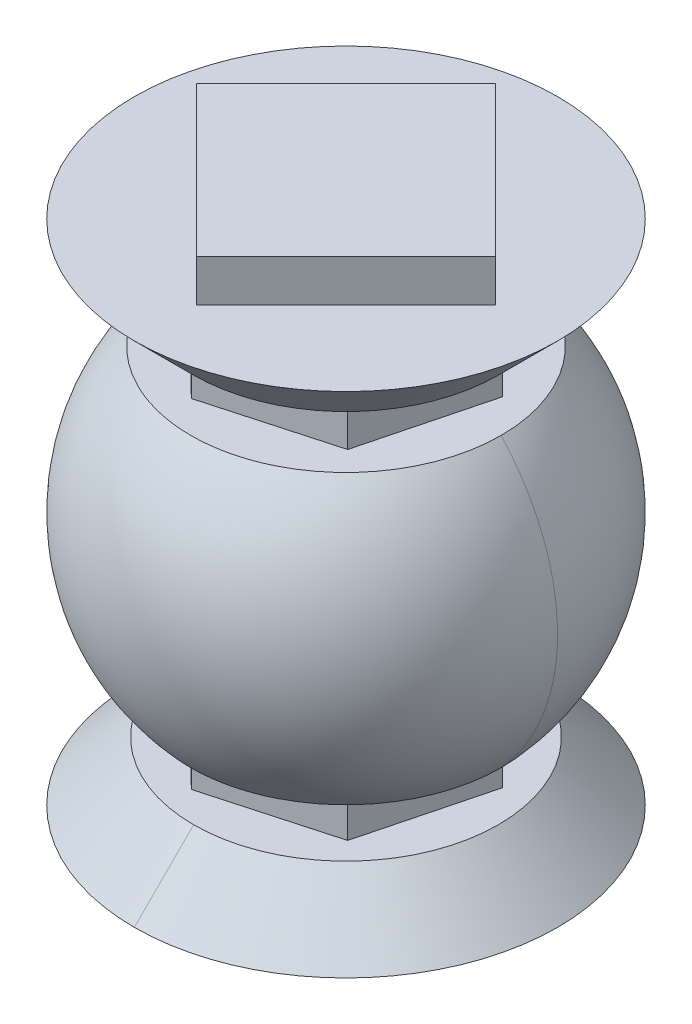
ISO-10303-21;
HEADER;
FILE_DESCRIPTION(('STEP AP214'),'2;1');
FILE_NAME('part.step','',(''),(''),'','','');
FILE_SCHEMA(('AUTOMOTIVE_DESIGN { 1 0 10303 214 1 1 1 1 }'));
ENDSEC;
DATA;
#1=APPLICATION_CONTEXT('core data for automotive mechanical design processes');
#2=APPLICATION_PROTOCOL_DEFINITION('international standard','automotive_design',2000,#1);
#3=PRODUCT_CONTEXT('',#1,'mechanical');
#4=PRODUCT('Part','Part','',(#3));
#5=PRODUCT_RELATED_PRODUCT_CATEGORY('part','',(#4));
#6=PRODUCT_DEFINITION_FORMATION('','',#4);
#7=PRODUCT_DEFINITION_CONTEXT('part definition',#1,'design');
#8=PRODUCT_DEFINITION('design','',#6,#7);
#9=PRODUCT_DEFINITION_SHAPE('','',#8);
#10=(LENGTH_UNIT() NAMED_UNIT(*) SI_UNIT(.MILLI.,.METRE.));
#11=(NAMED_UNIT(*) PLANE_ANGLE_UNIT() SI_UNIT($,.RADIAN.));
#12=(NAMED_UNIT(*) SI_UNIT($,.STERADIAN.) SOLID_ANGLE_UNIT());
#13=UNCERTAINTY_MEASURE_WITH_UNIT(LENGTH_MEASURE(1.E-05),#10,'distance_accuracy_value','');
#14=(GEOMETRIC_REPRESENTATION_CONTEXT(3) GLOBAL_UNCERTAINTY_ASSIGNED_CONTEXT((#13)) GLOBAL_UNIT_ASSIGNED_CONTEXT((#10,
#11,#12)) REPRESENTATION_CONTEXT('',''));
#15=CARTESIAN_POINT('',(0.,0.,0.));
#16=DIRECTION('',(0.,0.,1.));
#17=DIRECTION('',(1.,0.,0.));
#18=AXIS2_PLACEMENT_3D('',#15,#16,#17);
#19=CARTESIAN_POINT('',(0.,-35.,0.));
#20=DIRECTION('',(0.,-1.,0.));
#21=DIRECTION('',(0.,0.,-1.));
#22=AXIS2_PLACEMENT_3D('',#19,#20,#21);
#23=PLANE('',#22);
#24=CARTESIAN_POINT('',(0.,-35.,0.));
#25=DIRECTION('',(0.,1.,0.));
#26=DIRECTION('',(0.,0.,1.));
#27=AXIS2_PLACEMENT_3D('',#24,#25,#26);
#28=CIRCLE('',#27,0.00235012890702213);
#29=CARTESIAN_POINT('',(0.,-35.,0.00235012890702213));
#30=VERTEX_POINT('',#29);
#31=CARTESIAN_POINT('',(0.,-35.,-0.00235012890702213));
#32=VERTEX_POINT('',#31);
#33=EDGE_CURVE('E11',#30,#32,#28,.T.);
#34=ORIENTED_EDGE('',*,*,#33,.T.);
#35=CARTESIAN_POINT('',(0.,-35.,0.));
#36=DIRECTION('',(0.,1.,0.));
#37=DIRECTION('',(0.,0.,1.));
#38=AXIS2_PLACEMENT_3D('',#35,#36,#37);
#39=CIRCLE('',#38,0.00235012890702213);
#40=EDGE_CURVE('E591',#32,#30,#39,.T.);
#41=ORIENTED_EDGE('',*,*,#40,.T.);
#42=EDGE_LOOP('',(#34,#41));
#43=FACE_BOUND('',#42,.T.);
#44=DIRECTION('',(0.707106781186548,0.,-0.707106781186548));
#45=VECTOR('',#44,1.);
#46=CARTESIAN_POINT('',(17.6776695296637,-35.,0.));
#47=LINE('',#46,#45);
#48=CARTESIAN_POINT('',(0.,-35.,17.6776695296637));
#49=VERTEX_POINT('',#48);
#50=CARTESIAN_POINT('',(17.6776695296637,-35.,0.));
#51=VERTEX_POINT('',#50);
#52=EDGE_CURVE('E329',#49,#51,#47,.T.);
#53=ORIENTED_EDGE('',*,*,#52,.F.);
#54=DIRECTION('',(0.707106781186548,0.,0.707106781186548));
#55=VECTOR('',#54,1.);
#56=CARTESIAN_POINT('',(-17.6776695296637,-35.,0.));
#57=LINE('',#56,#55);
#58=CARTESIAN_POINT('',(-17.6776695296637,-35.,0.));
#59=VERTEX_POINT('',#58);
#60=EDGE_CURVE('E38',#59,#49,#57,.T.);
#61=ORIENTED_EDGE('',*,*,#60,.F.);
#62=DIRECTION('',(-0.707106781186548,0.,0.707106781186548));
#63=VECTOR('',#62,1.);
#64=CARTESIAN_POINT('',(0.,-35.,-17.6776695296637));
#65=LINE('',#64,#63);
#66=CARTESIAN_POINT('',(0.,-35.,-17.6776695296637));
#67=VERTEX_POINT('',#66);
#68=EDGE_CURVE('E46',#67,#59,#65,.T.);
#69=ORIENTED_EDGE('',*,*,#68,.F.);
#70=DIRECTION('',(-0.707106781186548,0.,-0.707106781186548));
#71=VECTOR('',#70,1.);
#72=CARTESIAN_POINT('',(0.,-35.,-17.6776695296637));
#73=LINE('',#72,#71);
#74=EDGE_CURVE('E349',#51,#67,#73,.T.);
#75=ORIENTED_EDGE('',*,*,#74,.F.);
#76=EDGE_LOOP('',(#53,#61,#69,#75));
#77=FACE_BOUND('',#76,.T.);
#78=ADVANCED_FACE('F16',(#43,#77),#23,.T.);
#79=CARTESIAN_POINT('',(0.,67.707423580786,0.));
#80=DIRECTION('',(0.,1.,0.));
#81=DIRECTION('',(0.,0.,1.));
#82=AXIS2_PLACEMENT_3D('',#79,#80,#81);
#83=CYLINDRICAL_SURFACE('',#82,0.00235012890702213);
#84=DIRECTION('',(0.,1.,0.));
#85=VECTOR('',#84,1.);
#86=CARTESIAN_POINT('',(0.,67.707423580786,-0.00235012890702213));
#87=LINE('',#86,#85);
#88=CARTESIAN_POINT('',(0.,-30.,-0.00235012890702213));
#89=VERTEX_POINT('',#88);
#90=EDGE_CURVE('E579',#32,#89,#87,.T.);
#91=ORIENTED_EDGE('',*,*,#90,.F.);
#92=ORIENTED_EDGE('',*,*,#33,.F.);
#93=DIRECTION('',(0.,1.,0.));
#94=VECTOR('',#93,1.);
#95=CARTESIAN_POINT('',(0.,67.707423580786,0.00235012890702213));
#96=LINE('',#95,#94);
#97=CARTESIAN_POINT('',(0.,-30.,0.00235012890702213));
#98=VERTEX_POINT('',#97);
#99=EDGE_CURVE('E582',#30,#98,#96,.T.);
#100=ORIENTED_EDGE('',*,*,#99,.T.);
#101=CARTESIAN_POINT('',(0.,-30.,0.));
#102=DIRECTION('',(0.,1.,0.));
#103=DIRECTION('',(0.,0.,1.));
#104=AXIS2_PLACEMENT_3D('',#101,#102,#103);
#105=CIRCLE('',#104,0.00235012890702213);
#106=EDGE_CURVE('E25',#98,#89,#105,.T.);
#107=ORIENTED_EDGE('',*,*,#106,.T.);
#108=EDGE_LOOP('',(#91,#92,#100,#107));
#109=FACE_BOUND('',#108,.T.);
#110=ADVANCED_FACE('F577',(#109),#83,.F.);
#111=CARTESIAN_POINT('',(0.,-30.,0.));
#112=DIRECTION('',(0.,1.,0.));
#113=DIRECTION('',(1.,0.,0.));
#114=AXIS2_PLACEMENT_3D('',#111,#112,#113);
#115=PLANE('',#114);
#116=ORIENTED_EDGE('',*,*,#106,.F.);
#117=CARTESIAN_POINT('',(0.,-30.,0.));
#118=DIRECTION('',(0.,1.,0.));
#119=DIRECTION('',(0.,0.,1.));
#120=AXIS2_PLACEMENT_3D('',#117,#118,#119);
#121=CIRCLE('',#120,0.00235012890702213);
#122=EDGE_CURVE('E585',#89,#98,#121,.T.);
#123=ORIENTED_EDGE('',*,*,#122,.F.);
#124=EDGE_LOOP('',(#116,#123));
#125=FACE_BOUND('',#124,.T.);
#126=ADVANCED_FACE('F18',(#125),#115,.F.);
#127=CARTESIAN_POINT('',(-17.6776695296637,-30.,0.));
#128=DIRECTION('',(0.707106781186548,0.,-0.707106781186548));
#129=DIRECTION('',(0.,-1.,0.));
#130=AXIS2_PLACEMENT_3D('',#127,#128,#129);
#131=PLANE('',#130);
#132=ORIENTED_EDGE('',*,*,#60,.T.);
#133=DIRECTION('',(0.,-1.,0.));
#134=VECTOR('',#133,1.);
#135=CARTESIAN_POINT('',(0.,-30.,17.6776695296637));
#136=LINE('',#135,#134);
#137=CARTESIAN_POINT('',(0.,-30.,17.6776695296637));
#138=VERTEX_POINT('',#137);
#139=EDGE_CURVE('E345',#138,#49,#136,.T.);
#140=ORIENTED_EDGE('',*,*,#139,.F.);
#141=DIRECTION('',(0.707106781186548,0.,0.707106781186548));
#142=VECTOR('',#141,1.);
#143=CARTESIAN_POINT('',(-17.6776695296637,-30.,0.));
#144=LINE('',#143,#142);
#145=CARTESIAN_POINT('',(-17.6776695296637,-30.,0.));
#146=VERTEX_POINT('',#145);
#147=EDGE_CURVE('E548',#146,#138,#144,.T.);
#148=ORIENTED_EDGE('',*,*,#147,.F.);
#149=DIRECTION('',(0.,-1.,0.));
#150=VECTOR('',#149,1.);
#151=CARTESIAN_POINT('',(-17.6776695296637,-30.,0.));
#152=LINE('',#151,#150);
#153=EDGE_CURVE('E566',#146,#59,#152,.T.);
#154=ORIENTED_EDGE('',*,*,#153,.T.);
#155=EDGE_LOOP('',(#132,#140,#148,#154));
#156=FACE_BOUND('',#155,.T.);
#157=ADVANCED_FACE('F1319',(#156),#131,.F.);
#158=CARTESIAN_POINT('',(0.,-30.,-17.6776695296637));
#159=DIRECTION('',(0.707106781186548,0.,0.707106781186548));
#160=DIRECTION('',(0.,-1.,0.));
#161=AXIS2_PLACEMENT_3D('',#158,#159,#160);
#162=PLANE('',#161);
#163=ORIENTED_EDGE('',*,*,#68,.T.);
#164=ORIENTED_EDGE('',*,*,#153,.F.);
#165=DIRECTION('',(-0.707106781186548,0.,0.707106781186548));
#166=VECTOR('',#165,1.);
#167=CARTESIAN_POINT('',(0.,-30.,-17.6776695296637));
#168=LINE('',#167,#166);
#169=CARTESIAN_POINT('',(0.,-30.,-17.6776695296637));
#170=VERTEX_POINT('',#169);
#171=EDGE_CURVE('E547',#170,#146,#168,.T.);
#172=ORIENTED_EDGE('',*,*,#171,.F.);
#173=DIRECTION('',(0.,-1.,0.));
#174=VECTOR('',#173,1.);
#175=CARTESIAN_POINT('',(0.,-30.,-17.6776695296637));
#176=LINE('',#175,#174);
#177=EDGE_CURVE('E561',#170,#67,#176,.T.);
#178=ORIENTED_EDGE('',*,*,#177,.T.);
#179=EDGE_LOOP('',(#163,#164,#172,#178));
#180=FACE_BOUND('',#179,.T.);
#181=ADVANCED_FACE('F1323',(#180),#162,.F.);
#182=CARTESIAN_POINT('',(0.,-30.,-17.6776695296637));
#183=DIRECTION('',(-0.707106781186548,0.,0.707106781186548));
#184=DIRECTION('',(0.,1.,0.));
#185=AXIS2_PLACEMENT_3D('',#182,#183,#184);
#186=PLANE('',#185);
#187=ORIENTED_EDGE('',*,*,#74,.T.);
#188=ORIENTED_EDGE('',*,*,#177,.F.);
#189=DIRECTION('',(-0.707106781186548,0.,-0.707106781186548));
#190=VECTOR('',#189,1.);
#191=CARTESIAN_POINT('',(0.,-30.,-17.6776695296637));
#192=LINE('',#191,#190);
#193=CARTESIAN_POINT('',(17.6776695296637,-30.,0.));
#194=VERTEX_POINT('',#193);
#195=EDGE_CURVE('E543',#194,#170,#192,.T.);
#196=ORIENTED_EDGE('',*,*,#195,.F.);
#197=DIRECTION('',(0.,-1.,0.));
#198=VECTOR('',#197,1.);
#199=CARTESIAN_POINT('',(17.6776695296637,-30.,0.));
#200=LINE('',#199,#198);
#201=EDGE_CURVE('E332',#194,#51,#200,.T.);
#202=ORIENTED_EDGE('',*,*,#201,.T.);
#203=EDGE_LOOP('',(#187,#188,#196,#202));
#204=FACE_BOUND('',#203,.T.);
#205=ADVANCED_FACE('F1407',(#204),#186,.F.);
#206=CARTESIAN_POINT('',(17.6776695296637,-30.,0.));
#207=DIRECTION('',(-0.707106781186548,0.,-0.707106781186548));
#208=DIRECTION('',(-0.707106781186548,0.,0.707106781186548));
#209=AXIS2_PLACEMENT_3D('',#206,#207,#208);
#210=PLANE('',#209);
#211=ORIENTED_EDGE('',*,*,#52,.T.);
#212=ORIENTED_EDGE('',*,*,#201,.F.);
#213=DIRECTION('',(0.707106781186548,0.,-0.707106781186548));
#214=VECTOR('',#213,1.);
#215=CARTESIAN_POINT('',(17.6776695296637,-30.,0.));
#216=LINE('',#215,#214);
#217=EDGE_CURVE('E333',#138,#194,#216,.T.);
#218=ORIENTED_EDGE('',*,*,#217,.F.);
#219=ORIENTED_EDGE('',*,*,#139,.T.);
#220=EDGE_LOOP('',(#211,#212,#218,#219));
#221=FACE_BOUND('',#220,.T.);
#222=ADVANCED_FACE('F1396',(#221),#210,.F.);
#223=CARTESIAN_POINT('',(0.,-30.,0.));
#224=DIRECTION('',(0.,1.,0.));
#225=DIRECTION('',(1.,0.,0.));
#226=AXIS2_PLACEMENT_3D('',#223,#224,#225);
#227=PLANE('',#226);
#228=ORIENTED_EDGE('',*,*,#195,.T.);
#229=ORIENTED_EDGE('',*,*,#171,.T.);
#230=ORIENTED_EDGE('',*,*,#147,.T.);
#231=ORIENTED_EDGE('',*,*,#217,.T.);
#232=EDGE_LOOP('',(#228,#229,#230,#231));
#233=FACE_BOUND('',#232,.T.);
#234=CARTESIAN_POINT('',(0.,-30.,0.));
#235=DIRECTION('',(0.,-1.,0.));
#236=DIRECTION('',(0.,0.,1.));
#237=AXIS2_PLACEMENT_3D('',#234,#235,#236);
#238=CIRCLE('',#237,25.002350128907);
#239=CARTESIAN_POINT('',(0.,-30.,-25.002350128907));
#240=VERTEX_POINT('',#239);
#241=CARTESIAN_POINT('',(0.,-30.,25.002350128907));
#242=VERTEX_POINT('',#241);
#243=EDGE_CURVE('E300',#240,#242,#238,.T.);
#244=ORIENTED_EDGE('',*,*,#243,.T.);
#245=CARTESIAN_POINT('',(0.,-30.,0.));
#246=DIRECTION('',(0.,-1.,0.));
#247=DIRECTION('',(0.,0.,1.));
#248=AXIS2_PLACEMENT_3D('',#245,#246,#247);
#249=CIRCLE('',#248,25.002350128907);
#250=EDGE_CURVE('E295',#242,#240,#249,.T.);
#251=ORIENTED_EDGE('',*,*,#250,.T.);
#252=EDGE_LOOP('',(#244,#251));
#253=FACE_BOUND('',#252,.T.);
#254=ADVANCED_FACE('F1385',(#233,#253),#227,.F.);
#255=CARTESIAN_POINT('',(0.,35.,0.));
#256=DIRECTION('',(0.,-1.,0.));
#257=DIRECTION('',(0.,0.,-1.));
#258=AXIS2_PLACEMENT_3D('',#255,#256,#257);
#259=PLANE('',#258);
#260=CARTESIAN_POINT('',(0.,35.,0.));
#261=DIRECTION('',(0.,1.,0.));
#262=DIRECTION('',(0.,0.,1.));
#263=AXIS2_PLACEMENT_3D('',#260,#261,#262);
#264=CIRCLE('',#263,0.00235012890702213);
#265=CARTESIAN_POINT('',(0.,35.,0.00235012890702213));
#266=VERTEX_POINT('',#265);
#267=CARTESIAN_POINT('',(0.,35.,-0.00235012890702213));
#268=VERTEX_POINT('',#267);
#269=EDGE_CURVE('E540',#266,#268,#264,.T.);
#270=ORIENTED_EDGE('',*,*,#269,.F.);
#271=CARTESIAN_POINT('',(0.,35.,0.));
#272=DIRECTION('',(0.,1.,0.));
#273=DIRECTION('',(0.,0.,1.));
#274=AXIS2_PLACEMENT_3D('',#271,#272,#273);
#275=CIRCLE('',#274,0.00235012890702213);
#276=EDGE_CURVE('E312',#268,#266,#275,.T.);
#277=ORIENTED_EDGE('',*,*,#276,.F.);
#278=EDGE_LOOP('',(#270,#277));
#279=FACE_BOUND('',#278,.T.);
#280=DIRECTION('',(0.707106781186548,0.,-0.707106781186548));
#281=VECTOR('',#280,1.);
#282=CARTESIAN_POINT('',(17.6776695296637,35.,0.));
#283=LINE('',#282,#281);
#284=CARTESIAN_POINT('',(0.,35.,17.6776695296637));
#285=VERTEX_POINT('',#284);
#286=CARTESIAN_POINT('',(17.6776695296637,35.,0.));
#287=VERTEX_POINT('',#286);
#288=EDGE_CURVE('E523',#285,#287,#283,.T.);
#289=ORIENTED_EDGE('',*,*,#288,.T.);
#290=DIRECTION('',(-0.707106781186548,0.,-0.707106781186548));
#291=VECTOR('',#290,1.);
#292=CARTESIAN_POINT('',(0.,35.,-17.6776695296637));
#293=LINE('',#292,#291);
#294=CARTESIAN_POINT('',(0.,35.,-17.6776695296637));
#295=VERTEX_POINT('',#294);
#296=EDGE_CURVE('E473',#287,#295,#293,.T.);
#297=ORIENTED_EDGE('',*,*,#296,.T.);
#298=DIRECTION('',(-0.707106781186548,0.,0.707106781186548));
#299=VECTOR('',#298,1.);
#300=CARTESIAN_POINT('',(0.,35.,-17.6776695296637));
#301=LINE('',#300,#299);
#302=CARTESIAN_POINT('',(-17.6776695296637,35.,0.));
#303=VERTEX_POINT('',#302);
#304=EDGE_CURVE('E474',#295,#303,#301,.T.);
#305=ORIENTED_EDGE('',*,*,#304,.T.);
#306=DIRECTION('',(0.707106781186548,0.,0.707106781186548));
#307=VECTOR('',#306,1.);
#308=CARTESIAN_POINT('',(-17.6776695296637,35.,0.));
#309=LINE('',#308,#307);
#310=EDGE_CURVE('E442',#303,#285,#309,.T.);
#311=ORIENTED_EDGE('',*,*,#310,.T.);
#312=EDGE_LOOP('',(#289,#297,#305,#311));
#313=FACE_BOUND('',#312,.T.);
#314=ADVANCED_FACE('F644',(#279,#313),#259,.F.);
#315=CARTESIAN_POINT('',(0.,67.707423580786,0.));
#316=DIRECTION('',(0.,1.,0.));
#317=DIRECTION('',(0.,0.,1.));
#318=AXIS2_PLACEMENT_3D('',#315,#316,#317);
#319=CYLINDRICAL_SURFACE('',#318,0.00235012890702213);
#320=DIRECTION('',(0.,1.,0.));
#321=VECTOR('',#320,1.);
#322=CARTESIAN_POINT('',(0.,67.707423580786,-0.00235012890702213));
#323=LINE('',#322,#321);
#324=CARTESIAN_POINT('',(0.,30.,-0.00235012890702213));
#325=VERTEX_POINT('',#324);
#326=EDGE_CURVE('E604',#325,#268,#323,.T.);
#327=ORIENTED_EDGE('',*,*,#326,.F.);
#328=CARTESIAN_POINT('',(0.,30.,0.));
#329=DIRECTION('',(0.,1.,0.));
#330=DIRECTION('',(0.,0.,1.));
#331=AXIS2_PLACEMENT_3D('',#328,#329,#330);
#332=CIRCLE('',#331,0.00235012890702213);
#333=CARTESIAN_POINT('',(0.,30.,0.00235012890702213));
#334=VERTEX_POINT('',#333);
#335=EDGE_CURVE('E537',#334,#325,#332,.T.);
#336=ORIENTED_EDGE('',*,*,#335,.F.);
#337=DIRECTION('',(0.,1.,0.));
#338=VECTOR('',#337,1.);
#339=CARTESIAN_POINT('',(0.,67.707423580786,0.00235012890702213));
#340=LINE('',#339,#338);
#341=EDGE_CURVE('E305',#334,#266,#340,.T.);
#342=ORIENTED_EDGE('',*,*,#341,.T.);
#343=ORIENTED_EDGE('',*,*,#269,.T.);
#344=EDGE_LOOP('',(#327,#336,#342,#343));
#345=FACE_BOUND('',#344,.T.);
#346=ADVANCED_FACE('F664',(#345),#319,.F.);
#347=CARTESIAN_POINT('',(0.,30.,0.));
#348=DIRECTION('',(0.,1.,0.));
#349=DIRECTION('',(1.,0.,0.));
#350=AXIS2_PLACEMENT_3D('',#347,#348,#349);
#351=PLANE('',#350);
#352=ORIENTED_EDGE('',*,*,#335,.T.);
#353=CARTESIAN_POINT('',(0.,30.,0.));
#354=DIRECTION('',(0.,1.,0.));
#355=DIRECTION('',(0.,0.,1.));
#356=AXIS2_PLACEMENT_3D('',#353,#354,#355);
#357=CIRCLE('',#356,0.00235012890702213);
#358=EDGE_CURVE('E610',#325,#334,#357,.T.);
#359=ORIENTED_EDGE('',*,*,#358,.T.);
#360=EDGE_LOOP('',(#352,#359));
#361=FACE_BOUND('',#360,.T.);
#362=ADVANCED_FACE('F656',(#361),#351,.T.);
#363=CARTESIAN_POINT('',(0.,30.,-17.6776695296637));
#364=DIRECTION('',(0.707106781186548,0.,-0.707106781186548));
#365=DIRECTION('',(0.,-1.,0.));
#366=AXIS2_PLACEMENT_3D('',#363,#364,#365);
#367=PLANE('',#366);
#368=ORIENTED_EDGE('',*,*,#296,.F.);
#369=DIRECTION('',(0.,1.,0.));
#370=VECTOR('',#369,1.);
#371=CARTESIAN_POINT('',(17.6776695296637,30.,0.));
#372=LINE('',#371,#370);
#373=CARTESIAN_POINT('',(17.6776695296637,30.,0.));
#374=VERTEX_POINT('',#373);
#375=EDGE_CURVE('E438',#374,#287,#372,.T.);
#376=ORIENTED_EDGE('',*,*,#375,.F.);
#377=DIRECTION('',(-0.707106781186548,0.,-0.707106781186548));
#378=VECTOR('',#377,1.);
#379=CARTESIAN_POINT('',(0.,30.,-17.6776695296637));
#380=LINE('',#379,#378);
#381=CARTESIAN_POINT('',(0.,30.,-17.6776695296637));
#382=VERTEX_POINT('',#381);
#383=EDGE_CURVE('E515',#374,#382,#380,.T.);
#384=ORIENTED_EDGE('',*,*,#383,.T.);
#385=DIRECTION('',(0.,1.,0.));
#386=VECTOR('',#385,1.);
#387=CARTESIAN_POINT('',(0.,30.,-17.6776695296637));
#388=LINE('',#387,#386);
#389=EDGE_CURVE('E469',#382,#295,#388,.T.);
#390=ORIENTED_EDGE('',*,*,#389,.T.);
#391=EDGE_LOOP('',(#368,#376,#384,#390));
#392=FACE_BOUND('',#391,.T.);
#393=ADVANCED_FACE('F654',(#392),#367,.T.);
#394=CARTESIAN_POINT('',(0.,30.,-17.6776695296637));
#395=DIRECTION('',(-0.707106781186548,0.,-0.707106781186548));
#396=DIRECTION('',(-0.707106781186548,0.,0.707106781186548));
#397=AXIS2_PLACEMENT_3D('',#394,#395,#396);
#398=PLANE('',#397);
#399=ORIENTED_EDGE('',*,*,#304,.F.);
#400=ORIENTED_EDGE('',*,*,#389,.F.);
#401=DIRECTION('',(-0.707106781186548,0.,0.707106781186548));
#402=VECTOR('',#401,1.);
#403=CARTESIAN_POINT('',(0.,30.,-17.6776695296637));
#404=LINE('',#403,#402);
#405=CARTESIAN_POINT('',(-17.6776695296637,30.,0.));
#406=VERTEX_POINT('',#405);
#407=EDGE_CURVE('E462',#382,#406,#404,.T.);
#408=ORIENTED_EDGE('',*,*,#407,.T.);
#409=DIRECTION('',(0.,1.,0.));
#410=VECTOR('',#409,1.);
#411=CARTESIAN_POINT('',(-17.6776695296637,30.,0.));
#412=LINE('',#411,#410);
#413=EDGE_CURVE('E529',#406,#303,#412,.T.);
#414=ORIENTED_EDGE('',*,*,#413,.T.);
#415=EDGE_LOOP('',(#399,#400,#408,#414));
#416=FACE_BOUND('',#415,.T.);
#417=ADVANCED_FACE('F647',(#416),#398,.T.);
#418=CARTESIAN_POINT('',(-17.6776695296637,30.,0.));
#419=DIRECTION('',(-0.707106781186548,0.,0.707106781186548));
#420=DIRECTION('',(0.,1.,0.));
#421=AXIS2_PLACEMENT_3D('',#418,#419,#420);
#422=PLANE('',#421);
#423=ORIENTED_EDGE('',*,*,#310,.F.);
#424=ORIENTED_EDGE('',*,*,#413,.F.);
#425=DIRECTION('',(0.707106781186548,0.,0.707106781186548));
#426=VECTOR('',#425,1.);
#427=CARTESIAN_POINT('',(-17.6776695296637,30.,0.));
#428=LINE('',#427,#426);
#429=CARTESIAN_POINT('',(0.,30.,17.6776695296637));
#430=VERTEX_POINT('',#429);
#431=EDGE_CURVE('E458',#406,#430,#428,.T.);
#432=ORIENTED_EDGE('',*,*,#431,.T.);
#433=DIRECTION('',(0.,1.,0.));
#434=VECTOR('',#433,1.);
#435=CARTESIAN_POINT('',(0.,30.,17.6776695296637));
#436=LINE('',#435,#434);
#437=EDGE_CURVE('E443',#430,#285,#436,.T.);
#438=ORIENTED_EDGE('',*,*,#437,.T.);
#439=EDGE_LOOP('',(#423,#424,#432,#438));
#440=FACE_BOUND('',#439,.T.);
#441=ADVANCED_FACE('F638',(#440),#422,.T.);
#442=CARTESIAN_POINT('',(17.6776695296637,30.,0.));
#443=DIRECTION('',(0.707106781186548,0.,0.707106781186548));
#444=DIRECTION('',(0.,-1.,0.));
#445=AXIS2_PLACEMENT_3D('',#442,#443,#444);
#446=PLANE('',#445);
#447=ORIENTED_EDGE('',*,*,#288,.F.);
#448=ORIENTED_EDGE('',*,*,#437,.F.);
#449=DIRECTION('',(0.707106781186548,0.,-0.707106781186548));
#450=VECTOR('',#449,1.);
#451=CARTESIAN_POINT('',(17.6776695296637,30.,0.));
#452=LINE('',#451,#450);
#453=EDGE_CURVE('E519',#430,#374,#452,.T.);
#454=ORIENTED_EDGE('',*,*,#453,.T.);
#455=ORIENTED_EDGE('',*,*,#375,.T.);
#456=EDGE_LOOP('',(#447,#448,#454,#455));
#457=FACE_BOUND('',#456,.T.);
#458=ADVANCED_FACE('F642',(#457),#446,.T.);
#459=CARTESIAN_POINT('',(0.,30.,0.));
#460=DIRECTION('',(0.,1.,0.));
#461=DIRECTION('',(1.,0.,0.));
#462=AXIS2_PLACEMENT_3D('',#459,#460,#461);
#463=PLANE('',#462);
#464=ORIENTED_EDGE('',*,*,#431,.F.);
#465=ORIENTED_EDGE('',*,*,#407,.F.);
#466=ORIENTED_EDGE('',*,*,#383,.F.);
#467=ORIENTED_EDGE('',*,*,#453,.F.);
#468=EDGE_LOOP('',(#464,#465,#466,#467));
#469=FACE_BOUND('',#468,.T.);
#470=CARTESIAN_POINT('',(0.,30.,0.));
#471=DIRECTION('',(0.,1.,0.));
#472=DIRECTION('',(0.,0.,1.));
#473=AXIS2_PLACEMENT_3D('',#470,#471,#472);
#474=CIRCLE('',#473,25.002350128907);
#475=CARTESIAN_POINT('',(0.,30.,25.002350128907));
#476=VERTEX_POINT('',#475);
#477=CARTESIAN_POINT('',(0.,30.,-25.002350128907));
#478=VERTEX_POINT('',#477);
#479=EDGE_CURVE('E320',#476,#478,#474,.T.);
#480=ORIENTED_EDGE('',*,*,#479,.T.);
#481=CARTESIAN_POINT('',(0.,30.,0.));
#482=DIRECTION('',(0.,1.,0.));
#483=DIRECTION('',(0.,0.,1.));
#484=AXIS2_PLACEMENT_3D('',#481,#482,#483);
#485=CIRCLE('',#484,25.002350128907);
#486=EDGE_CURVE('E290',#478,#476,#485,.T.);
#487=ORIENTED_EDGE('',*,*,#486,.T.);
#488=EDGE_LOOP('',(#480,#487));
#489=FACE_BOUND('',#488,.T.);
#490=ADVANCED_FACE('F651',(#469,#489),#463,.T.);
#491=CARTESIAN_POINT('',(0.,-20.,0.));
#492=DIRECTION('',(0.,-1.,0.));
#493=DIRECTION('',(0.,0.,-1.));
#494=AXIS2_PLACEMENT_3D('',#491,#492,#493);
#495=CONICAL_SURFACE('',#494,15.,0.785515656036115);
#496=DIRECTION('',(0.,-0.707023696464563,0.707189856147262));
#497=VECTOR('',#496,1.);
#498=CARTESIAN_POINT('',(0.,-20.,15.));
#499=LINE('',#498,#497);
#500=CARTESIAN_POINT('',(0.,-23.,18.0007050386721));
#501=VERTEX_POINT('',#500);
#502=EDGE_CURVE('E293',#501,#242,#499,.T.);
#503=ORIENTED_EDGE('',*,*,#502,.F.);
#504=CARTESIAN_POINT('',(0.,-23.,0.));
#505=DIRECTION('',(0.,-1.,0.));
#506=DIRECTION('',(0.,0.,1.));
#507=AXIS2_PLACEMENT_3D('',#504,#505,#506);
#508=CIRCLE('',#507,18.0007050386721);
#509=CARTESIAN_POINT('',(0.,-23.,-18.0007050386721));
#510=VERTEX_POINT('',#509);
#511=EDGE_CURVE('E280',#501,#510,#508,.T.);
#512=ORIENTED_EDGE('',*,*,#511,.T.);
#513=DIRECTION('',(0.,-0.707023696464563,-0.707189856147262));
#514=VECTOR('',#513,1.);
#515=CARTESIAN_POINT('',(0.,-20.,-15.));
#516=LINE('',#515,#514);
#517=EDGE_CURVE('E303',#510,#240,#516,.T.);
#518=ORIENTED_EDGE('',*,*,#517,.T.);
#519=ORIENTED_EDGE('',*,*,#250,.F.);
#520=EDGE_LOOP('',(#503,#512,#518,#519));
#521=FACE_BOUND('',#520,.T.);
#522=ADVANCED_FACE('F294',(#521),#495,.T.);
#523=CARTESIAN_POINT('',(10.7017224091414,-23.,10.5106202232637));
#524=DIRECTION('',(0.968218238813169,0.,0.250106861220409));
#525=DIRECTION('',(0.,-1.,0.));
#526=AXIS2_PLACEMENT_3D('',#523,#524,#525);
#527=PLANE('',#526);
#528=DIRECTION('',(0.250106861220409,0.,-0.968218238813169));
#529=VECTOR('',#528,1.);
#530=CARTESIAN_POINT('',(10.7017224091414,-17.,10.5106202232637));
#531=LINE('',#530,#529);
#532=CARTESIAN_POINT('',(10.7017224091414,-17.,10.5106202232637));
#533=VERTEX_POINT('',#532);
#534=CARTESIAN_POINT('',(14.4533253274476,-17.,-4.01265335893382));
#535=VERTEX_POINT('',#534);
#536=EDGE_CURVE('E418',#533,#535,#531,.T.);
#537=ORIENTED_EDGE('',*,*,#536,.F.);
#538=DIRECTION('',(0.,1.,0.));
#539=VECTOR('',#538,1.);
#540=CARTESIAN_POINT('',(10.7017224091414,-23.,10.5106202232637));
#541=LINE('',#540,#539);
#542=CARTESIAN_POINT('',(10.7017224091414,-23.,10.5106202232637));
#543=VERTEX_POINT('',#542);
#544=EDGE_CURVE('E500',#543,#533,#541,.T.);
#545=ORIENTED_EDGE('',*,*,#544,.F.);
#546=DIRECTION('',(0.250106861220409,0.,-0.968218238813169));
#547=VECTOR('',#546,1.);
#548=CARTESIAN_POINT('',(10.7017224091414,-23.,10.5106202232637));
#549=LINE('',#548,#547);
#550=CARTESIAN_POINT('',(14.4533253274476,-23.,-4.01265335893382));
#551=VERTEX_POINT('',#550);
#552=EDGE_CURVE('E325',#543,#551,#549,.T.);
#553=ORIENTED_EDGE('',*,*,#552,.T.);
#554=DIRECTION('',(0.,1.,0.));
#555=VECTOR('',#554,1.);
#556=CARTESIAN_POINT('',(14.4533253274476,-23.,-4.01265335893382));
#557=LINE('',#556,#555);
#558=EDGE_CURVE('E507',#551,#535,#557,.T.);
#559=ORIENTED_EDGE('',*,*,#558,.T.);
#560=EDGE_LOOP('',(#537,#545,#553,#559));
#561=FACE_BOUND('',#560,.T.);
#562=ADVANCED_FACE('F1292',(#561),#527,.T.);
#563=CARTESIAN_POINT('',(14.4533253274476,-23.,-4.01265335893382));
#564=DIRECTION('',(0.700708014884248,0.,-0.713448160609428));
#565=DIRECTION('',(0.,-1.,0.));
#566=AXIS2_PLACEMENT_3D('',#563,#564,#565);
#567=PLANE('',#566);
#568=DIRECTION('',(-0.713448160609428,0.,-0.700708014884248));
#569=VECTOR('',#568,1.);
#570=CARTESIAN_POINT('',(14.4533253274476,-17.,-4.01265335893382));
#571=LINE('',#570,#569);
#572=CARTESIAN_POINT('',(3.75160291830613,-17.,-14.5232735821975));
#573=VERTEX_POINT('',#572);
#574=EDGE_CURVE('E413',#535,#573,#571,.T.);
#575=ORIENTED_EDGE('',*,*,#574,.F.);
#576=ORIENTED_EDGE('',*,*,#558,.F.);
#577=DIRECTION('',(-0.713448160609428,0.,-0.700708014884248));
#578=VECTOR('',#577,1.);
#579=CARTESIAN_POINT('',(14.4533253274476,-23.,-4.01265335893382));
#580=LINE('',#579,#578);
#581=CARTESIAN_POINT('',(3.75160291830613,-23.,-14.5232735821975));
#582=VERTEX_POINT('',#581);
#583=EDGE_CURVE('E321',#551,#582,#580,.T.);
#584=ORIENTED_EDGE('',*,*,#583,.T.);
#585=DIRECTION('',(0.,1.,0.));
#586=VECTOR('',#585,1.);
#587=CARTESIAN_POINT('',(3.75160291830613,-23.,-14.5232735821975));
#588=LINE('',#587,#586);
#589=EDGE_CURVE('E491',#582,#573,#588,.T.);
#590=ORIENTED_EDGE('',*,*,#589,.T.);
#591=EDGE_LOOP('',(#575,#576,#584,#590));
#592=FACE_BOUND('',#591,.T.);
#593=ADVANCED_FACE('F697',(#592),#567,.T.);
#594=CARTESIAN_POINT('',(3.75160291830613,-23.,-14.5232735821975));
#595=DIRECTION('',(-0.267510223928921,0.,-0.963555021829837));
#596=DIRECTION('',(-0.963555021829837,0.,0.267510223928921));
#597=AXIS2_PLACEMENT_3D('',#594,#595,#596);
#598=PLANE('',#597);
#599=DIRECTION('',(-0.963555021829837,0.,0.267510223928921));
#600=VECTOR('',#599,1.);
#601=CARTESIAN_POINT('',(3.75160291830613,-17.,-14.5232735821975));
#602=LINE('',#601,#600);
#603=CARTESIAN_POINT('',(-10.7017224091414,-17.,-10.5106202232637));
#604=VERTEX_POINT('',#603);
#605=EDGE_CURVE('E417',#573,#604,#602,.T.);
#606=ORIENTED_EDGE('',*,*,#605,.F.);
#607=ORIENTED_EDGE('',*,*,#589,.F.);
#608=DIRECTION('',(-0.963555021829837,0.,0.267510223928921));
#609=VECTOR('',#608,1.);
#610=CARTESIAN_POINT('',(3.75160291830613,-23.,-14.5232735821975));
#611=LINE('',#610,#609);
#612=CARTESIAN_POINT('',(-10.7017224091414,-23.,-10.5106202232637));
#613=VERTEX_POINT('',#612);
#614=EDGE_CURVE('E326',#582,#613,#611,.T.);
#615=ORIENTED_EDGE('',*,*,#614,.T.);
#616=DIRECTION('',(0.,1.,0.));
#617=VECTOR('',#616,1.);
#618=CARTESIAN_POINT('',(-10.7017224091414,-23.,-10.5106202232637));
#619=LINE('',#618,#617);
#620=EDGE_CURVE('E488',#613,#604,#619,.T.);
#621=ORIENTED_EDGE('',*,*,#620,.T.);
#622=EDGE_LOOP('',(#606,#607,#615,#621));
#623=FACE_BOUND('',#622,.T.);
#624=ADVANCED_FACE('F692',(#623),#598,.T.);
#625=CARTESIAN_POINT('',(-10.7017224091414,-23.,-10.5106202232637));
#626=DIRECTION('',(-0.968218238813169,0.,-0.250106861220409));
#627=DIRECTION('',(-0.250106861220409,0.,0.968218238813169));
#628=AXIS2_PLACEMENT_3D('',#625,#626,#627);
#629=PLANE('',#628);
#630=DIRECTION('',(-0.250106861220409,0.,0.968218238813169));
#631=VECTOR('',#630,1.);
#632=CARTESIAN_POINT('',(-10.7017224091414,-17.,-10.5106202232637));
#633=LINE('',#632,#631);
#634=CARTESIAN_POINT('',(-14.4533253274476,-17.,4.01265335893382));
#635=VERTEX_POINT('',#634);
#636=EDGE_CURVE('E487',#604,#635,#633,.T.);
#637=ORIENTED_EDGE('',*,*,#636,.F.);
#638=ORIENTED_EDGE('',*,*,#620,.F.);
#639=DIRECTION('',(-0.250106861220409,0.,0.968218238813169));
#640=VECTOR('',#639,1.);
#641=CARTESIAN_POINT('',(-10.7017224091414,-23.,-10.5106202232637));
#642=LINE('',#641,#640);
#643=CARTESIAN_POINT('',(-14.4533253274476,-23.,4.01265335893382));
#644=VERTEX_POINT('',#643);
#645=EDGE_CURVE('E457',#613,#644,#642,.T.);
#646=ORIENTED_EDGE('',*,*,#645,.T.);
#647=DIRECTION('',(0.,1.,0.));
#648=VECTOR('',#647,1.);
#649=CARTESIAN_POINT('',(-14.4533253274476,-23.,4.01265335893382));
#650=LINE('',#649,#648);
#651=EDGE_CURVE('E492',#644,#635,#650,.T.);
#652=ORIENTED_EDGE('',*,*,#651,.T.);
#653=EDGE_LOOP('',(#637,#638,#646,#652));
#654=FACE_BOUND('',#653,.T.);
#655=ADVANCED_FACE('F689',(#654),#629,.T.);
#656=CARTESIAN_POINT('',(-14.4533253274476,-23.,4.01265335893382));
#657=DIRECTION('',(-0.700708014884248,0.,0.713448160609428));
#658=DIRECTION('',(0.,1.,0.));
#659=AXIS2_PLACEMENT_3D('',#656,#657,#658);
#660=PLANE('',#659);
#661=DIRECTION('',(0.713448160609428,0.,0.700708014884248));
#662=VECTOR('',#661,1.);
#663=CARTESIAN_POINT('',(-14.4533253274476,-17.,4.01265335893382));
#664=LINE('',#663,#662);
#665=CARTESIAN_POINT('',(-3.75160291830614,-17.,14.5232735821975));
#666=VERTEX_POINT('',#665);
#667=EDGE_CURVE('E496',#635,#666,#664,.T.);
#668=ORIENTED_EDGE('',*,*,#667,.F.);
#669=ORIENTED_EDGE('',*,*,#651,.F.);
#670=DIRECTION('',(0.713448160609428,0.,0.700708014884248));
#671=VECTOR('',#670,1.);
#672=CARTESIAN_POINT('',(-14.4533253274476,-23.,4.01265335893382));
#673=LINE('',#672,#671);
#674=CARTESIAN_POINT('',(-3.75160291830614,-23.,14.5232735821975));
#675=VERTEX_POINT('',#674);
#676=EDGE_CURVE('E289',#644,#675,#673,.T.);
#677=ORIENTED_EDGE('',*,*,#676,.T.);
#678=DIRECTION('',(0.,1.,0.));
#679=VECTOR('',#678,1.);
#680=CARTESIAN_POINT('',(-3.75160291830614,-23.,14.5232735821975));
#681=LINE('',#680,#679);
#682=EDGE_CURVE('E497',#675,#666,#681,.T.);
#683=ORIENTED_EDGE('',*,*,#682,.T.);
#684=EDGE_LOOP('',(#668,#669,#677,#683));
#685=FACE_BOUND('',#684,.T.);
#686=ADVANCED_FACE('F686',(#685),#660,.T.);
#687=CARTESIAN_POINT('',(-3.75160291830614,-23.,14.5232735821975));
#688=DIRECTION('',(0.267510223928921,0.,0.963555021829837));
#689=DIRECTION('',(0.,-1.,0.));
#690=AXIS2_PLACEMENT_3D('',#687,#688,#689);
#691=PLANE('',#690);
#692=DIRECTION('',(0.963555021829837,0.,-0.267510223928921));
#693=VECTOR('',#692,1.);
#694=CARTESIAN_POINT('',(-3.75160291830614,-17.,14.5232735821975));
#695=LINE('',#694,#693);
#696=EDGE_CURVE('E424',#666,#533,#695,.T.);
#697=ORIENTED_EDGE('',*,*,#696,.F.);
#698=ORIENTED_EDGE('',*,*,#682,.F.);
#699=DIRECTION('',(0.963555021829837,0.,-0.267510223928921));
#700=VECTOR('',#699,1.);
#701=CARTESIAN_POINT('',(-3.75160291830614,-23.,14.5232735821975));
#702=LINE('',#701,#700);
#703=EDGE_CURVE('E428',#675,#543,#702,.T.);
#704=ORIENTED_EDGE('',*,*,#703,.T.);
#705=ORIENTED_EDGE('',*,*,#544,.T.);
#706=EDGE_LOOP('',(#697,#698,#704,#705));
#707=FACE_BOUND('',#706,.T.);
#708=ADVANCED_FACE('F682',(#707),#691,.T.);
#709=CARTESIAN_POINT('',(0.,-17.,0.));
#710=DIRECTION('',(0.,1.,0.));
#711=DIRECTION('',(1.,0.,0.));
#712=AXIS2_PLACEMENT_3D('',#709,#710,#711);
#713=PLANE('',#712);
#714=ORIENTED_EDGE('',*,*,#696,.T.);
#715=ORIENTED_EDGE('',*,*,#536,.T.);
#716=ORIENTED_EDGE('',*,*,#574,.T.);
#717=ORIENTED_EDGE('',*,*,#605,.T.);
#718=ORIENTED_EDGE('',*,*,#636,.T.);
#719=ORIENTED_EDGE('',*,*,#667,.T.);
#720=EDGE_LOOP('',(#714,#715,#716,#717,#718,#719));
#721=FACE_BOUND('',#720,.T.);
#722=CARTESIAN_POINT('',(0.,-17.,0.));
#723=DIRECTION('',(0.,-1.,0.));
#724=DIRECTION('',(0.,0.,1.));
#725=AXIS2_PLACEMENT_3D('',#722,#723,#724);
#726=CIRCLE('',#725,18.3303027798234);
#727=CARTESIAN_POINT('',(-18.3303027798234,-17.,0.));
#728=VERTEX_POINT('',#727);
#729=CARTESIAN_POINT('',(18.3303027798234,-17.,0.));
#730=VERTEX_POINT('',#729);
#731=EDGE_CURVE('E379',#728,#730,#726,.T.);
#732=ORIENTED_EDGE('',*,*,#731,.T.);
#733=CARTESIAN_POINT('',(0.,-17.,0.));
#734=DIRECTION('',(0.,-1.,0.));
#735=DIRECTION('',(0.,0.,1.));
#736=AXIS2_PLACEMENT_3D('',#733,#734,#735);
#737=CIRCLE('',#736,18.3303027798234);
#738=EDGE_CURVE('E319',#730,#728,#737,.T.);
#739=ORIENTED_EDGE('',*,*,#738,.T.);
#740=EDGE_LOOP('',(#732,#739));
#741=FACE_BOUND('',#740,.T.);
#742=ADVANCED_FACE('F679',(#721,#741),#713,.F.);
#743=CARTESIAN_POINT('',(0.,-23.,0.));
#744=DIRECTION('',(0.,1.,0.));
#745=DIRECTION('',(1.,0.,0.));
#746=AXIS2_PLACEMENT_3D('',#743,#744,#745);
#747=PLANE('',#746);
#748=ORIENTED_EDGE('',*,*,#676,.F.);
#749=ORIENTED_EDGE('',*,*,#645,.F.);
#750=ORIENTED_EDGE('',*,*,#614,.F.);
#751=ORIENTED_EDGE('',*,*,#583,.F.);
#752=ORIENTED_EDGE('',*,*,#552,.F.);
#753=ORIENTED_EDGE('',*,*,#703,.F.);
#754=EDGE_LOOP('',(#748,#749,#750,#751,#752,#753));
#755=FACE_BOUND('',#754,.T.);
#756=CARTESIAN_POINT('',(0.,-23.,0.));
#757=DIRECTION('',(0.,-1.,0.));
#758=DIRECTION('',(0.,0.,1.));
#759=AXIS2_PLACEMENT_3D('',#756,#757,#758);
#760=CIRCLE('',#759,18.0007050386721);
#761=EDGE_CURVE('E284',#510,#501,#760,.T.);
#762=ORIENTED_EDGE('',*,*,#761,.F.);
#763=ORIENTED_EDGE('',*,*,#511,.F.);
#764=EDGE_LOOP('',(#762,#763));
#765=FACE_BOUND('',#764,.T.);
#766=ADVANCED_FACE('F282',(#755,#765),#747,.T.);
#767=CARTESIAN_POINT('',(0.,20.,0.));
#768=DIRECTION('',(0.,1.,0.));
#769=DIRECTION('',(0.,0.,1.));
#770=AXIS2_PLACEMENT_3D('',#767,#768,#769);
#771=CONICAL_SURFACE('',#770,15.,0.785515656036115);
#772=DIRECTION('',(0.,0.707023696464563,-0.707189856147262));
#773=VECTOR('',#772,1.);
#774=CARTESIAN_POINT('',(0.,20.,-15.));
#775=LINE('',#774,#773);
#776=CARTESIAN_POINT('',(0.,23.,-18.0007050386721));
#777=VERTEX_POINT('',#776);
#778=EDGE_CURVE('E344',#777,#478,#775,.T.);
#779=ORIENTED_EDGE('',*,*,#778,.F.);
#780=CARTESIAN_POINT('',(0.,23.,0.));
#781=DIRECTION('',(0.,1.,0.));
#782=DIRECTION('',(0.,0.,1.));
#783=AXIS2_PLACEMENT_3D('',#780,#781,#782);
#784=CIRCLE('',#783,18.0007050386721);
#785=CARTESIAN_POINT('',(0.,23.,18.0007050386721));
#786=VERTEX_POINT('',#785);
#787=EDGE_CURVE('E383',#777,#786,#784,.T.);
#788=ORIENTED_EDGE('',*,*,#787,.T.);
#789=DIRECTION('',(0.,0.707023696464563,0.707189856147262));
#790=VECTOR('',#789,1.);
#791=CARTESIAN_POINT('',(0.,20.,15.));
#792=LINE('',#791,#790);
#793=EDGE_CURVE('E315',#786,#476,#792,.T.);
#794=ORIENTED_EDGE('',*,*,#793,.T.);
#795=ORIENTED_EDGE('',*,*,#486,.F.);
#796=EDGE_LOOP('',(#779,#788,#794,#795));
#797=FACE_BOUND('',#796,.T.);
#798=ADVANCED_FACE('F677',(#797),#771,.T.);
#799=CARTESIAN_POINT('',(10.7017224091414,17.,10.5106202232637));
#800=DIRECTION('',(0.968218238813169,0.,0.250106861220409));
#801=DIRECTION('',(0.,-1.,0.));
#802=AXIS2_PLACEMENT_3D('',#799,#800,#801);
#803=PLANE('',#802);
#804=DIRECTION('',(0.250106861220409,0.,-0.968218238813169));
#805=VECTOR('',#804,1.);
#806=CARTESIAN_POINT('',(10.7017224091414,23.,10.5106202232637));
#807=LINE('',#806,#805);
#808=CARTESIAN_POINT('',(10.7017224091414,23.,10.5106202232637));
#809=VERTEX_POINT('',#808);
#810=CARTESIAN_POINT('',(14.4533253274476,23.,-4.01265335893382));
#811=VERTEX_POINT('',#810);
#812=EDGE_CURVE('E394',#809,#811,#807,.T.);
#813=ORIENTED_EDGE('',*,*,#812,.F.);
#814=DIRECTION('',(0.,1.,0.));
#815=VECTOR('',#814,1.);
#816=CARTESIAN_POINT('',(10.7017224091414,17.,10.5106202232637));
#817=LINE('',#816,#815);
#818=CARTESIAN_POINT('',(10.7017224091414,17.,10.5106202232637));
#819=VERTEX_POINT('',#818);
#820=EDGE_CURVE('E366',#819,#809,#817,.T.);
#821=ORIENTED_EDGE('',*,*,#820,.F.);
#822=DIRECTION('',(0.250106861220409,0.,-0.968218238813169));
#823=VECTOR('',#822,1.);
#824=CARTESIAN_POINT('',(10.7017224091414,17.,10.5106202232637));
#825=LINE('',#824,#823);
#826=CARTESIAN_POINT('',(14.4533253274476,17.,-4.01265335893382));
#827=VERTEX_POINT('',#826);
#828=EDGE_CURVE('E390',#819,#827,#825,.T.);
#829=ORIENTED_EDGE('',*,*,#828,.T.);
#830=DIRECTION('',(0.,1.,0.));
#831=VECTOR('',#830,1.);
#832=CARTESIAN_POINT('',(14.4533253274476,17.,-4.01265335893382));
#833=LINE('',#832,#831);
#834=EDGE_CURVE('E337',#827,#811,#833,.T.);
#835=ORIENTED_EDGE('',*,*,#834,.T.);
#836=EDGE_LOOP('',(#813,#821,#829,#835));
#837=FACE_BOUND('',#836,.T.);
#838=ADVANCED_FACE('F1172',(#837),#803,.T.);
#839=CARTESIAN_POINT('',(14.4533253274476,17.,-4.01265335893382));
#840=DIRECTION('',(0.700708014884248,0.,-0.713448160609428));
#841=DIRECTION('',(0.,-1.,0.));
#842=AXIS2_PLACEMENT_3D('',#839,#840,#841);
#843=PLANE('',#842);
#844=DIRECTION('',(-0.713448160609428,0.,-0.700708014884248));
#845=VECTOR('',#844,1.);
#846=CARTESIAN_POINT('',(14.4533253274476,23.,-4.01265335893382));
#847=LINE('',#846,#845);
#848=CARTESIAN_POINT('',(3.75160291830613,23.,-14.5232735821975));
#849=VERTEX_POINT('',#848);
#850=EDGE_CURVE('E398',#811,#849,#847,.T.);
#851=ORIENTED_EDGE('',*,*,#850,.F.);
#852=ORIENTED_EDGE('',*,*,#834,.F.);
#853=DIRECTION('',(-0.713448160609428,0.,-0.700708014884248));
#854=VECTOR('',#853,1.);
#855=CARTESIAN_POINT('',(14.4533253274476,17.,-4.01265335893382));
#856=LINE('',#855,#854);
#857=CARTESIAN_POINT('',(3.75160291830613,17.,-14.5232735821975));
#858=VERTEX_POINT('',#857);
#859=EDGE_CURVE('E423',#827,#858,#856,.T.);
#860=ORIENTED_EDGE('',*,*,#859,.T.);
#861=DIRECTION('',(0.,1.,0.));
#862=VECTOR('',#861,1.);
#863=CARTESIAN_POINT('',(3.75160291830613,17.,-14.5232735821975));
#864=LINE('',#863,#862);
#865=EDGE_CURVE('E449',#858,#849,#864,.T.);
#866=ORIENTED_EDGE('',*,*,#865,.T.);
#867=EDGE_LOOP('',(#851,#852,#860,#866));
#868=FACE_BOUND('',#867,.T.);
#869=ADVANCED_FACE('F1176',(#868),#843,.T.);
#870=CARTESIAN_POINT('',(3.75160291830613,17.,-14.5232735821975));
#871=DIRECTION('',(-0.267510223928921,0.,-0.963555021829837));
#872=DIRECTION('',(-0.963555021829837,0.,0.267510223928921));
#873=AXIS2_PLACEMENT_3D('',#870,#871,#872);
#874=PLANE('',#873);
#875=DIRECTION('',(-0.963555021829837,0.,0.267510223928921));
#876=VECTOR('',#875,1.);
#877=CARTESIAN_POINT('',(3.75160291830613,23.,-14.5232735821975));
#878=LINE('',#877,#876);
#879=CARTESIAN_POINT('',(-10.7017224091414,23.,-10.5106202232637));
#880=VERTEX_POINT('',#879);
#881=EDGE_CURVE('E404',#849,#880,#878,.T.);
#882=ORIENTED_EDGE('',*,*,#881,.F.);
#883=ORIENTED_EDGE('',*,*,#865,.F.);
#884=DIRECTION('',(-0.963555021829837,0.,0.267510223928921));
#885=VECTOR('',#884,1.);
#886=CARTESIAN_POINT('',(3.75160291830613,17.,-14.5232735821975));
#887=LINE('',#886,#885);
#888=CARTESIAN_POINT('',(-10.7017224091414,17.,-10.5106202232637));
#889=VERTEX_POINT('',#888);
#890=EDGE_CURVE('E419',#858,#889,#887,.T.);
#891=ORIENTED_EDGE('',*,*,#890,.T.);
#892=DIRECTION('',(0.,1.,0.));
#893=VECTOR('',#892,1.);
#894=CARTESIAN_POINT('',(-10.7017224091414,17.,-10.5106202232637));
#895=LINE('',#894,#893);
#896=EDGE_CURVE('E446',#889,#880,#895,.T.);
#897=ORIENTED_EDGE('',*,*,#896,.T.);
#898=EDGE_LOOP('',(#882,#883,#891,#897));
#899=FACE_BOUND('',#898,.T.);
#900=ADVANCED_FACE('F1187',(#899),#874,.T.);
#901=CARTESIAN_POINT('',(-10.7017224091414,17.,-10.5106202232637));
#902=DIRECTION('',(-0.968218238813169,0.,-0.250106861220409));
#903=DIRECTION('',(-0.250106861220409,0.,0.968218238813169));
#904=AXIS2_PLACEMENT_3D('',#901,#902,#903);
#905=PLANE('',#904);
#906=DIRECTION('',(-0.250106861220409,0.,0.968218238813169));
#907=VECTOR('',#906,1.);
#908=CARTESIAN_POINT('',(-10.7017224091414,23.,-10.5106202232637));
#909=LINE('',#908,#907);
#910=CARTESIAN_POINT('',(-14.4533253274476,23.,4.01265335893382));
#911=VERTEX_POINT('',#910);
#912=EDGE_CURVE('E399',#880,#911,#909,.T.);
#913=ORIENTED_EDGE('',*,*,#912,.F.);
#914=ORIENTED_EDGE('',*,*,#896,.F.);
#915=DIRECTION('',(-0.250106861220409,0.,0.968218238813169));
#916=VECTOR('',#915,1.);
#917=CARTESIAN_POINT('',(-10.7017224091414,17.,-10.5106202232637));
#918=LINE('',#917,#916);
#919=CARTESIAN_POINT('',(-14.4533253274476,17.,4.01265335893382));
#920=VERTEX_POINT('',#919);
#921=EDGE_CURVE('E412',#889,#920,#918,.T.);
#922=ORIENTED_EDGE('',*,*,#921,.T.);
#923=DIRECTION('',(0.,1.,0.));
#924=VECTOR('',#923,1.);
#925=CARTESIAN_POINT('',(-14.4533253274476,17.,4.01265335893382));
#926=LINE('',#925,#924);
#927=EDGE_CURVE('E437',#920,#911,#926,.T.);
#928=ORIENTED_EDGE('',*,*,#927,.T.);
#929=EDGE_LOOP('',(#913,#914,#922,#928));
#930=FACE_BOUND('',#929,.T.);
#931=ADVANCED_FACE('F1112',(#930),#905,.T.);
#932=CARTESIAN_POINT('',(-14.4533253274476,17.,4.01265335893382));
#933=DIRECTION('',(-0.700708014884248,0.,0.713448160609428));
#934=DIRECTION('',(0.,1.,0.));
#935=AXIS2_PLACEMENT_3D('',#932,#933,#934);
#936=PLANE('',#935);
#937=DIRECTION('',(0.713448160609428,0.,0.700708014884248));
#938=VECTOR('',#937,1.);
#939=CARTESIAN_POINT('',(-14.4533253274476,23.,4.01265335893382));
#940=LINE('',#939,#938);
#941=CARTESIAN_POINT('',(-3.75160291830614,23.,14.5232735821975));
#942=VERTEX_POINT('',#941);
#943=EDGE_CURVE('E403',#911,#942,#940,.T.);
#944=ORIENTED_EDGE('',*,*,#943,.F.);
#945=ORIENTED_EDGE('',*,*,#927,.F.);
#946=DIRECTION('',(0.713448160609428,0.,0.700708014884248));
#947=VECTOR('',#946,1.);
#948=CARTESIAN_POINT('',(-14.4533253274476,17.,4.01265335893382));
#949=LINE('',#948,#947);
#950=CARTESIAN_POINT('',(-3.75160291830614,17.,14.5232735821975));
#951=VERTEX_POINT('',#950);
#952=EDGE_CURVE('E408',#920,#951,#949,.T.);
#953=ORIENTED_EDGE('',*,*,#952,.T.);
#954=DIRECTION('',(0.,1.,0.));
#955=VECTOR('',#954,1.);
#956=CARTESIAN_POINT('',(-3.75160291830614,17.,14.5232735821975));
#957=LINE('',#956,#955);
#958=EDGE_CURVE('E363',#951,#942,#957,.T.);
#959=ORIENTED_EDGE('',*,*,#958,.T.);
#960=EDGE_LOOP('',(#944,#945,#953,#959));
#961=FACE_BOUND('',#960,.T.);
#962=ADVANCED_FACE('F1082',(#961),#936,.T.);
#963=CARTESIAN_POINT('',(-3.75160291830614,17.,14.5232735821975));
#964=DIRECTION('',(0.267510223928921,0.,0.963555021829837));
#965=DIRECTION('',(0.,-1.,0.));
#966=AXIS2_PLACEMENT_3D('',#963,#964,#965);
#967=PLANE('',#966);
#968=DIRECTION('',(0.963555021829837,0.,-0.267510223928921));
#969=VECTOR('',#968,1.);
#970=CARTESIAN_POINT('',(-3.75160291830614,23.,14.5232735821975));
#971=LINE('',#970,#969);
#972=EDGE_CURVE('E386',#942,#809,#971,.T.);
#973=ORIENTED_EDGE('',*,*,#972,.F.);
#974=ORIENTED_EDGE('',*,*,#958,.F.);
#975=DIRECTION('',(0.963555021829837,0.,-0.267510223928921));
#976=VECTOR('',#975,1.);
#977=CARTESIAN_POINT('',(-3.75160291830614,17.,14.5232735821975));
#978=LINE('',#977,#976);
#979=EDGE_CURVE('E367',#951,#819,#978,.T.);
#980=ORIENTED_EDGE('',*,*,#979,.T.);
#981=ORIENTED_EDGE('',*,*,#820,.T.);
#982=EDGE_LOOP('',(#973,#974,#980,#981));
#983=FACE_BOUND('',#982,.T.);
#984=ADVANCED_FACE('F1077',(#983),#967,.T.);
#985=CARTESIAN_POINT('',(0.,17.,0.));
#986=DIRECTION('',(0.,1.,0.));
#987=DIRECTION('',(1.,0.,0.));
#988=AXIS2_PLACEMENT_3D('',#985,#986,#987);
#989=PLANE('',#988);
#990=ORIENTED_EDGE('',*,*,#952,.F.);
#991=ORIENTED_EDGE('',*,*,#921,.F.);
#992=ORIENTED_EDGE('',*,*,#890,.F.);
#993=ORIENTED_EDGE('',*,*,#859,.F.);
#994=ORIENTED_EDGE('',*,*,#828,.F.);
#995=ORIENTED_EDGE('',*,*,#979,.F.);
#996=EDGE_LOOP('',(#990,#991,#992,#993,#994,#995));
#997=FACE_BOUND('',#996,.T.);
#998=CARTESIAN_POINT('',(0.,17.,0.));
#999=DIRECTION('',(0.,-1.,0.));
#1000=DIRECTION('',(0.,0.,1.));
#1001=AXIS2_PLACEMENT_3D('',#998,#999,#1000);
#1002=CIRCLE('',#1001,18.3303027798234);
#1003=CARTESIAN_POINT('',(-18.3303027798234,17.,0.));
#1004=VERTEX_POINT('',#1003);
#1005=CARTESIAN_POINT('',(18.3303027798234,17.,0.));
#1006=VERTEX_POINT('',#1005);
#1007=EDGE_CURVE('E382',#1004,#1006,#1002,.T.);
#1008=ORIENTED_EDGE('',*,*,#1007,.F.);
#1009=CARTESIAN_POINT('',(0.,17.,0.));
#1010=DIRECTION('',(0.,-1.,0.));
#1011=DIRECTION('',(0.,0.,1.));
#1012=AXIS2_PLACEMENT_3D('',#1009,#1010,#1011);
#1013=CIRCLE('',#1012,18.3303027798234);
#1014=EDGE_CURVE('E371',#1006,#1004,#1013,.T.);
#1015=ORIENTED_EDGE('',*,*,#1014,.F.);
#1016=EDGE_LOOP('',(#1008,#1015));
#1017=FACE_BOUND('',#1016,.T.);
#1018=ADVANCED_FACE('F1081',(#997,#1017),#989,.T.);
#1019=CARTESIAN_POINT('',(0.,23.,0.));
#1020=DIRECTION('',(0.,1.,0.));
#1021=DIRECTION('',(1.,0.,0.));
#1022=AXIS2_PLACEMENT_3D('',#1019,#1020,#1021);
#1023=PLANE('',#1022);
#1024=ORIENTED_EDGE('',*,*,#972,.T.);
#1025=ORIENTED_EDGE('',*,*,#812,.T.);
#1026=ORIENTED_EDGE('',*,*,#850,.T.);
#1027=ORIENTED_EDGE('',*,*,#881,.T.);
#1028=ORIENTED_EDGE('',*,*,#912,.T.);
#1029=ORIENTED_EDGE('',*,*,#943,.T.);
#1030=EDGE_LOOP('',(#1024,#1025,#1026,#1027,#1028,#1029));
#1031=FACE_BOUND('',#1030,.T.);
#1032=CARTESIAN_POINT('',(0.,23.,0.));
#1033=DIRECTION('',(0.,1.,0.));
#1034=DIRECTION('',(0.,0.,1.));
#1035=AXIS2_PLACEMENT_3D('',#1032,#1033,#1034);
#1036=CIRCLE('',#1035,18.0007050386721);
#1037=EDGE_CURVE('E340',#786,#777,#1036,.T.);
#1038=ORIENTED_EDGE('',*,*,#1037,.F.);
#1039=ORIENTED_EDGE('',*,*,#787,.F.);
#1040=EDGE_LOOP('',(#1038,#1039));
#1041=FACE_BOUND('',#1040,.T.);
#1042=ADVANCED_FACE('F1164',(#1031,#1041),#1023,.F.);
#1043=CARTESIAN_POINT('',(0.,0.,0.));
#1044=DIRECTION('',(0.,0.,1.));
#1045=DIRECTION('',(-1.,0.,0.));
#1046=AXIS2_PLACEMENT_3D('',#1043,#1044,#1045);
#1047=SPHERICAL_SURFACE('',#1046,25.);
#1048=CARTESIAN_POINT('',(0.,0.,0.));
#1049=DIRECTION('',(0.,0.,1.));
#1050=DIRECTION('',(1.,0.,0.));
#1051=AXIS2_PLACEMENT_3D('',#1048,#1049,#1050);
#1052=CIRCLE('',#1051,25.);
#1053=EDGE_CURVE('E362',#730,#1006,#1052,.T.);
#1054=ORIENTED_EDGE('',*,*,#1053,.F.);
#1055=ORIENTED_EDGE('',*,*,#731,.F.);
#1056=CARTESIAN_POINT('',(0.,0.,0.));
#1057=DIRECTION('',(0.,0.,-1.));
#1058=DIRECTION('',(-1.,0.,0.));
#1059=AXIS2_PLACEMENT_3D('',#1056,#1057,#1058);
#1060=CIRCLE('',#1059,25.);
#1061=EDGE_CURVE('E375',#728,#1004,#1060,.T.);
#1062=ORIENTED_EDGE('',*,*,#1061,.T.);
#1063=ORIENTED_EDGE('',*,*,#1007,.T.);
#1064=EDGE_LOOP('',(#1054,#1055,#1062,#1063));
#1065=FACE_BOUND('',#1064,.T.);
#1066=ADVANCED_FACE('F1153',(#1065),#1047,.T.);
#1067=CARTESIAN_POINT('',(0.,0.,0.));
#1068=DIRECTION('',(0.,0.,1.));
#1069=DIRECTION('',(-1.,0.,0.));
#1070=AXIS2_PLACEMENT_3D('',#1067,#1068,#1069);
#1071=SPHERICAL_SURFACE('',#1070,25.);
#1072=ORIENTED_EDGE('',*,*,#738,.F.);
#1073=ORIENTED_EDGE('',*,*,#1053,.T.);
#1074=ORIENTED_EDGE('',*,*,#1014,.T.);
#1075=ORIENTED_EDGE('',*,*,#1061,.F.);
#1076=EDGE_LOOP('',(#1072,#1073,#1074,#1075));
#1077=FACE_BOUND('',#1076,.T.);
#1078=ADVANCED_FACE('F1142',(#1077),#1071,.T.);
#1079=CARTESIAN_POINT('',(0.,20.,0.));
#1080=DIRECTION('',(0.,1.,0.));
#1081=DIRECTION('',(0.,0.,1.));
#1082=AXIS2_PLACEMENT_3D('',#1079,#1080,#1081);
#1083=CONICAL_SURFACE('',#1082,15.,0.785515656036115);
#1084=ORIENTED_EDGE('',*,*,#1037,.T.);
#1085=ORIENTED_EDGE('',*,*,#778,.T.);
#1086=ORIENTED_EDGE('',*,*,#479,.F.);
#1087=ORIENTED_EDGE('',*,*,#793,.F.);
#1088=EDGE_LOOP('',(#1084,#1085,#1086,#1087));
#1089=FACE_BOUND('',#1088,.T.);
#1090=ADVANCED_FACE('F1132',(#1089),#1083,.T.);
#1091=CARTESIAN_POINT('',(0.,-20.,0.));
#1092=DIRECTION('',(0.,-1.,0.));
#1093=DIRECTION('',(0.,0.,-1.));
#1094=AXIS2_PLACEMENT_3D('',#1091,#1092,#1093);
#1095=CONICAL_SURFACE('',#1094,15.,0.785515656036115);
#1096=ORIENTED_EDGE('',*,*,#761,.T.);
#1097=ORIENTED_EDGE('',*,*,#502,.T.);
#1098=ORIENTED_EDGE('',*,*,#243,.F.);
#1099=ORIENTED_EDGE('',*,*,#517,.F.);
#1100=EDGE_LOOP('',(#1096,#1097,#1098,#1099));
#1101=FACE_BOUND('',#1100,.T.);
#1102=ADVANCED_FACE('F302',(#1101),#1095,.T.);
#1103=CARTESIAN_POINT('',(0.,67.707423580786,0.));
#1104=DIRECTION('',(0.,1.,0.));
#1105=DIRECTION('',(0.,0.,1.));
#1106=AXIS2_PLACEMENT_3D('',#1103,#1104,#1105);
#1107=CYLINDRICAL_SURFACE('',#1106,0.00235012890702213);
#1108=ORIENTED_EDGE('',*,*,#358,.F.);
#1109=ORIENTED_EDGE('',*,*,#326,.T.);
#1110=ORIENTED_EDGE('',*,*,#276,.T.);
#1111=ORIENTED_EDGE('',*,*,#341,.F.);
#1112=EDGE_LOOP('',(#1108,#1109,#1110,#1111));
#1113=FACE_BOUND('',#1112,.T.);
#1114=ADVANCED_FACE('F1093',(#1113),#1107,.F.);
#1115=CARTESIAN_POINT('',(0.,67.707423580786,0.));
#1116=DIRECTION('',(0.,1.,0.));
#1117=DIRECTION('',(0.,0.,1.));
#1118=AXIS2_PLACEMENT_3D('',#1115,#1116,#1117);
#1119=CYLINDRICAL_SURFACE('',#1118,0.00235012890702213);
#1120=ORIENTED_EDGE('',*,*,#40,.F.);
#1121=ORIENTED_EDGE('',*,*,#90,.T.);
#1122=ORIENTED_EDGE('',*,*,#122,.T.);
#1123=ORIENTED_EDGE('',*,*,#99,.F.);
#1124=EDGE_LOOP('',(#1120,#1121,#1122,#1123));
#1125=FACE_BOUND('',#1124,.T.);
#1126=ADVANCED_FACE('F589',(#1125),#1119,.F.);
#1127=CLOSED_SHELL('',(#78,#110,#126,#157,#181,#205,#222,#254,#314,#346,#362,#393,#417,#441,
#458,#490,#522,#562,#593,#624,#655,#686,#708,#742,#766,#798,#838,#869,#900,#931,#962,#984,#1018,
#1042,#1066,#1078,#1090,#1102,#1114,#1126));
#1128=MANIFOLD_SOLID_BREP('B1',#1127);
#1129=ADVANCED_BREP_SHAPE_REPRESENTATION('',(#18,#1128),#14);
#1130=SHAPE_DEFINITION_REPRESENTATION(#9,#1129);
ENDSEC;
END-ISO-10303-21;
